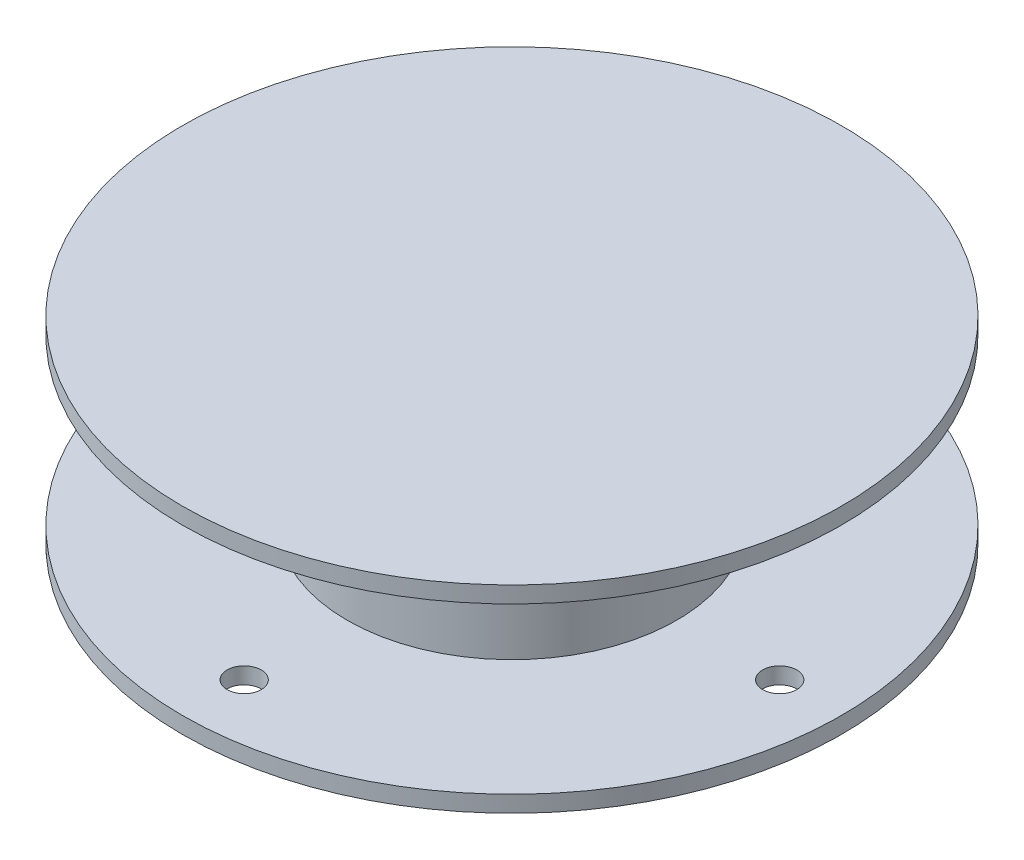
ISO-10303-21;
HEADER;
FILE_DESCRIPTION(('STEP AP214'),'2;1');
FILE_NAME('part.step','',(''),(''),'','','');
FILE_SCHEMA(('AUTOMOTIVE_DESIGN { 1 0 10303 214 1 1 1 1 }'));
ENDSEC;
DATA;
#1=APPLICATION_CONTEXT('core data for automotive mechanical design processes');
#2=APPLICATION_PROTOCOL_DEFINITION('international standard','automotive_design',2000,#1);
#3=PRODUCT_CONTEXT('',#1,'mechanical');
#4=PRODUCT('Part','Part','',(#3));
#5=PRODUCT_RELATED_PRODUCT_CATEGORY('part','',(#4));
#6=PRODUCT_DEFINITION_FORMATION('','',#4);
#7=PRODUCT_DEFINITION_CONTEXT('part definition',#1,'design');
#8=PRODUCT_DEFINITION('design','',#6,#7);
#9=PRODUCT_DEFINITION_SHAPE('','',#8);
#10=(LENGTH_UNIT() NAMED_UNIT(*) SI_UNIT(.MILLI.,.METRE.));
#11=(NAMED_UNIT(*) PLANE_ANGLE_UNIT() SI_UNIT($,.RADIAN.));
#12=(NAMED_UNIT(*) SI_UNIT($,.STERADIAN.) SOLID_ANGLE_UNIT());
#13=UNCERTAINTY_MEASURE_WITH_UNIT(LENGTH_MEASURE(1.E-05),#10,'distance_accuracy_value','');
#14=(GEOMETRIC_REPRESENTATION_CONTEXT(3) GLOBAL_UNCERTAINTY_ASSIGNED_CONTEXT((#13)) GLOBAL_UNIT_ASSIGNED_CONTEXT((#10,
#11,#12)) REPRESENTATION_CONTEXT('',''));
#15=CARTESIAN_POINT('',(0.,0.,0.));
#16=DIRECTION('',(0.,0.,1.));
#17=DIRECTION('',(1.,0.,0.));
#18=AXIS2_PLACEMENT_3D('',#15,#16,#17);
#19=CARTESIAN_POINT('',(0.,2.,0.));
#20=DIRECTION('',(0.,-1.,0.));
#21=DIRECTION('',(0.,0.,-1.));
#22=AXIS2_PLACEMENT_3D('',#19,#20,#21);
#23=CYLINDRICAL_SURFACE('',#22,40.);
#24=CARTESIAN_POINT('',(0.,2.,0.));
#25=DIRECTION('',(0.,1.,0.));
#26=DIRECTION('',(0.,0.,1.));
#27=AXIS2_PLACEMENT_3D('',#24,#25,#26);
#28=CIRCLE('',#27,40.);
#29=CARTESIAN_POINT('',(0.,2.,40.));
#30=VERTEX_POINT('',#29);
#31=EDGE_CURVE('E51',#30,#30,#28,.T.);
#32=ORIENTED_EDGE('',*,*,#31,.F.);
#33=EDGE_LOOP('',(#32));
#34=FACE_BOUND('',#33,.T.);
#35=CARTESIAN_POINT('',(0.,0.,0.));
#36=DIRECTION('',(0.,1.,0.));
#37=DIRECTION('',(0.,0.,1.));
#38=AXIS2_PLACEMENT_3D('',#35,#36,#37);
#39=CIRCLE('',#38,40.);
#40=CARTESIAN_POINT('',(0.,0.,40.));
#41=VERTEX_POINT('',#40);
#42=EDGE_CURVE('E46',#41,#41,#39,.T.);
#43=ORIENTED_EDGE('',*,*,#42,.T.);
#44=EDGE_LOOP('',(#43));
#45=FACE_BOUND('',#44,.T.);
#46=ADVANCED_FACE('F43',(#34,#45),#23,.T.);
#47=CARTESIAN_POINT('',(0.,2.,0.));
#48=DIRECTION('',(0.,1.,0.));
#49=DIRECTION('',(0.,0.,1.));
#50=AXIS2_PLACEMENT_3D('',#47,#48,#49);
#51=PLANE('',#50);
#52=CARTESIAN_POINT('',(0.,2.,32.5));
#53=DIRECTION('',(0.,1.,0.));
#54=DIRECTION('',(0.,0.,1.));
#55=AXIS2_PLACEMENT_3D('',#52,#53,#54);
#56=CIRCLE('',#55,2.07357767100753);
#57=CARTESIAN_POINT('',(0.,2.,30.4264223289925));
#58=VERTEX_POINT('',#57);
#59=EDGE_CURVE('E92',#58,#58,#56,.F.);
#60=ORIENTED_EDGE('',*,*,#59,.T.);
#61=EDGE_LOOP('',(#60));
#62=FACE_BOUND('',#61,.T.);
#63=CARTESIAN_POINT('',(32.5,2.,0.));
#64=DIRECTION('',(0.,1.,0.));
#65=DIRECTION('',(0.,0.,1.));
#66=AXIS2_PLACEMENT_3D('',#63,#64,#65);
#67=CIRCLE('',#66,2.07357767100753);
#68=CARTESIAN_POINT('',(32.5,2.,-2.07357767100753));
#69=VERTEX_POINT('',#68);
#70=EDGE_CURVE('E88',#69,#69,#67,.F.);
#71=ORIENTED_EDGE('',*,*,#70,.T.);
#72=EDGE_LOOP('',(#71));
#73=FACE_BOUND('',#72,.T.);
#74=CARTESIAN_POINT('',(0.,2.,-32.5));
#75=DIRECTION('',(0.,1.,0.));
#76=DIRECTION('',(0.,0.,1.));
#77=AXIS2_PLACEMENT_3D('',#74,#75,#76);
#78=CIRCLE('',#77,2.07357767100753);
#79=CARTESIAN_POINT('',(0.,2.,-34.5735776710075));
#80=VERTEX_POINT('',#79);
#81=EDGE_CURVE('E80',#80,#80,#78,.F.);
#82=ORIENTED_EDGE('',*,*,#81,.T.);
#83=EDGE_LOOP('',(#82));
#84=FACE_BOUND('',#83,.T.);
#85=CARTESIAN_POINT('',(-32.5,2.,0.));
#86=DIRECTION('',(0.,1.,0.));
#87=DIRECTION('',(0.,0.,1.));
#88=AXIS2_PLACEMENT_3D('',#85,#86,#87);
#89=CIRCLE('',#88,2.07357767100753);
#90=CARTESIAN_POINT('',(-32.5,2.,-2.07357767100753));
#91=VERTEX_POINT('',#90);
#92=EDGE_CURVE('E71',#91,#91,#89,.F.);
#93=ORIENTED_EDGE('',*,*,#92,.T.);
#94=EDGE_LOOP('',(#93));
#95=FACE_BOUND('',#94,.T.);
#96=CARTESIAN_POINT('',(0.,2.,0.));
#97=DIRECTION('',(0.,1.,0.));
#98=DIRECTION('',(0.,0.,1.));
#99=AXIS2_PLACEMENT_3D('',#96,#97,#98);
#100=CIRCLE('',#99,20.);
#101=CARTESIAN_POINT('',(0.,2.,20.));
#102=VERTEX_POINT('',#101);
#103=EDGE_CURVE('E10',#102,#102,#100,.T.);
#104=ORIENTED_EDGE('',*,*,#103,.F.);
#105=EDGE_LOOP('',(#104));
#106=FACE_BOUND('',#105,.T.);
#107=ORIENTED_EDGE('',*,*,#31,.T.);
#108=EDGE_LOOP('',(#107));
#109=FACE_BOUND('',#108,.T.);
#110=ADVANCED_FACE('F103',(#62,#73,#84,#95,#106,#109),#51,.T.);
#111=CARTESIAN_POINT('',(0.,0.,0.));
#112=DIRECTION('',(0.,1.,0.));
#113=DIRECTION('',(0.,0.,1.));
#114=AXIS2_PLACEMENT_3D('',#111,#112,#113);
#115=PLANE('',#114);
#116=CARTESIAN_POINT('',(0.,0.,32.5));
#117=DIRECTION('',(0.,-1.,0.));
#118=DIRECTION('',(0.,0.,-1.));
#119=AXIS2_PLACEMENT_3D('',#116,#117,#118);
#120=CIRCLE('',#119,2.07357767100753);
#121=CARTESIAN_POINT('',(0.,0.,30.4264223289925));
#122=VERTEX_POINT('',#121);
#123=EDGE_CURVE('E63',#122,#122,#120,.T.);
#124=ORIENTED_EDGE('',*,*,#123,.F.);
#125=EDGE_LOOP('',(#124));
#126=FACE_BOUND('',#125,.T.);
#127=CARTESIAN_POINT('',(32.5,0.,0.));
#128=DIRECTION('',(0.,-1.,0.));
#129=DIRECTION('',(0.,0.,-1.));
#130=AXIS2_PLACEMENT_3D('',#127,#128,#129);
#131=CIRCLE('',#130,2.07357767100753);
#132=CARTESIAN_POINT('',(32.5,0.,-2.07357767100753));
#133=VERTEX_POINT('',#132);
#134=EDGE_CURVE('E84',#133,#133,#131,.T.);
#135=ORIENTED_EDGE('',*,*,#134,.F.);
#136=EDGE_LOOP('',(#135));
#137=FACE_BOUND('',#136,.T.);
#138=CARTESIAN_POINT('',(0.,0.,-32.5));
#139=DIRECTION('',(0.,-1.,0.));
#140=DIRECTION('',(0.,0.,-1.));
#141=AXIS2_PLACEMENT_3D('',#138,#139,#140);
#142=CIRCLE('',#141,2.07357767100753);
#143=CARTESIAN_POINT('',(0.,0.,-34.5735776710075));
#144=VERTEX_POINT('',#143);
#145=EDGE_CURVE('E75',#144,#144,#142,.T.);
#146=ORIENTED_EDGE('',*,*,#145,.F.);
#147=EDGE_LOOP('',(#146));
#148=FACE_BOUND('',#147,.T.);
#149=CARTESIAN_POINT('',(-32.5,0.,0.));
#150=DIRECTION('',(0.,-1.,0.));
#151=DIRECTION('',(0.,0.,-1.));
#152=AXIS2_PLACEMENT_3D('',#149,#150,#151);
#153=CIRCLE('',#152,2.07357767100753);
#154=CARTESIAN_POINT('',(-32.5,0.,-2.07357767100753));
#155=VERTEX_POINT('',#154);
#156=EDGE_CURVE('E76',#155,#155,#153,.T.);
#157=ORIENTED_EDGE('',*,*,#156,.F.);
#158=EDGE_LOOP('',(#157));
#159=FACE_BOUND('',#158,.T.);
#160=ORIENTED_EDGE('',*,*,#42,.F.);
#161=EDGE_LOOP('',(#160));
#162=FACE_BOUND('',#161,.T.);
#163=ADVANCED_FACE('F113',(#126,#137,#148,#159,#162),#115,.F.);
#164=CARTESIAN_POINT('',(0.,12.,0.));
#165=DIRECTION('',(0.,-1.,0.));
#166=DIRECTION('',(0.,0.,-1.));
#167=AXIS2_PLACEMENT_3D('',#164,#165,#166);
#168=CYLINDRICAL_SURFACE('',#167,20.);
#169=ORIENTED_EDGE('',*,*,#103,.T.);
#170=EDGE_LOOP('',(#169));
#171=FACE_BOUND('',#170,.T.);
#172=CARTESIAN_POINT('',(0.,22.,0.));
#173=DIRECTION('',(0.,1.,0.));
#174=DIRECTION('',(0.,0.,1.));
#175=AXIS2_PLACEMENT_3D('',#172,#173,#174);
#176=CIRCLE('',#175,20.);
#177=CARTESIAN_POINT('',(0.,22.,20.));
#178=VERTEX_POINT('',#177);
#179=EDGE_CURVE('E67',#178,#178,#176,.T.);
#180=ORIENTED_EDGE('',*,*,#179,.F.);
#181=EDGE_LOOP('',(#180));
#182=FACE_BOUND('',#181,.T.);
#183=ADVANCED_FACE('F116',(#171,#182),#168,.T.);
#184=CARTESIAN_POINT('',(0.,22.,0.));
#185=DIRECTION('',(0.,1.,0.));
#186=DIRECTION('',(0.,0.,-1.));
#187=AXIS2_PLACEMENT_3D('',#184,#185,#186);
#188=CYLINDRICAL_SURFACE('',#187,40.);
#189=CARTESIAN_POINT('',(0.,22.,0.));
#190=DIRECTION('',(0.,1.,0.));
#191=DIRECTION('',(0.,0.,1.));
#192=AXIS2_PLACEMENT_3D('',#189,#190,#191);
#193=CIRCLE('',#192,40.);
#194=CARTESIAN_POINT('',(0.,22.,40.));
#195=VERTEX_POINT('',#194);
#196=EDGE_CURVE('E62',#195,#195,#193,.T.);
#197=ORIENTED_EDGE('',*,*,#196,.T.);
#198=EDGE_LOOP('',(#197));
#199=FACE_BOUND('',#198,.T.);
#200=CARTESIAN_POINT('',(0.,24.,0.));
#201=DIRECTION('',(0.,1.,0.));
#202=DIRECTION('',(0.,0.,1.));
#203=AXIS2_PLACEMENT_3D('',#200,#201,#202);
#204=CIRCLE('',#203,40.);
#205=CARTESIAN_POINT('',(0.,24.,40.));
#206=VERTEX_POINT('',#205);
#207=EDGE_CURVE('E58',#206,#206,#204,.T.);
#208=ORIENTED_EDGE('',*,*,#207,.F.);
#209=EDGE_LOOP('',(#208));
#210=FACE_BOUND('',#209,.T.);
#211=ADVANCED_FACE('F141',(#199,#210),#188,.T.);
#212=CARTESIAN_POINT('',(0.,22.,0.));
#213=DIRECTION('',(0.,-1.,0.));
#214=DIRECTION('',(0.,0.,1.));
#215=AXIS2_PLACEMENT_3D('',#212,#213,#214);
#216=PLANE('',#215);
#217=ORIENTED_EDGE('',*,*,#179,.T.);
#218=EDGE_LOOP('',(#217));
#219=FACE_BOUND('',#218,.T.);
#220=ORIENTED_EDGE('',*,*,#196,.F.);
#221=EDGE_LOOP('',(#220));
#222=FACE_BOUND('',#221,.T.);
#223=ADVANCED_FACE('F144',(#219,#222),#216,.T.);
#224=CARTESIAN_POINT('',(0.,24.,0.));
#225=DIRECTION('',(0.,-1.,0.));
#226=DIRECTION('',(0.,0.,1.));
#227=AXIS2_PLACEMENT_3D('',#224,#225,#226);
#228=PLANE('',#227);
#229=ORIENTED_EDGE('',*,*,#207,.T.);
#230=EDGE_LOOP('',(#229));
#231=FACE_BOUND('',#230,.T.);
#232=ADVANCED_FACE('F146',(#231),#228,.F.);
#233=CARTESIAN_POINT('',(-32.5,24.001,0.));
#234=DIRECTION('',(0.,-1.,0.));
#235=DIRECTION('',(0.,0.,-1.));
#236=AXIS2_PLACEMENT_3D('',#233,#234,#235);
#237=CYLINDRICAL_SURFACE('',#236,2.07357767100753);
#238=CARTESIAN_POINT('',(-32.5,2.,-2.07357767100753));
#239=CARTESIAN_POINT('',(-32.5,1.97916666666667,-2.07357767100753));
#240=CARTESIAN_POINT('',(-32.5,1.95833333333333,-2.07357767100753));
#241=CARTESIAN_POINT('',(-32.5,1.91666666666666,-2.07357767100753));
#242=CARTESIAN_POINT('',(-32.5,1.89583333333333,-2.07357767100753));
#243=CARTESIAN_POINT('',(-32.5,1.85416666666666,-2.07357767100753));
#244=CARTESIAN_POINT('',(-32.5,1.83333333333333,-2.07357767100753));
#245=CARTESIAN_POINT('',(-32.5,1.79166666666666,-2.07357767100753));
#246=CARTESIAN_POINT('',(-32.5,1.77083333333333,-2.07357767100753));
#247=CARTESIAN_POINT('',(-32.5,1.72916666666666,-2.07357767100753));
#248=CARTESIAN_POINT('',(-32.5,1.70833333333333,-2.07357767100753));
#249=CARTESIAN_POINT('',(-32.5,1.66666666666666,-2.07357767100753));
#250=CARTESIAN_POINT('',(-32.5,1.64583333333333,-2.07357767100753));
#251=CARTESIAN_POINT('',(-32.5,1.60416666666666,-2.07357767100753));
#252=CARTESIAN_POINT('',(-32.5,1.58333333333333,-2.07357767100753));
#253=CARTESIAN_POINT('',(-32.5,1.54166666666666,-2.07357767100753));
#254=CARTESIAN_POINT('',(-32.5,1.52083333333333,-2.07357767100753));
#255=CARTESIAN_POINT('',(-32.5,1.47916666666667,-2.07357767100753));
#256=CARTESIAN_POINT('',(-32.5,1.45833333333333,-2.07357767100753));
#257=CARTESIAN_POINT('',(-32.5,1.41666666666667,-2.07357767100753));
#258=CARTESIAN_POINT('',(-32.5,1.39583333333333,-2.07357767100753));
#259=CARTESIAN_POINT('',(-32.5,1.35416666666667,-2.07357767100753));
#260=CARTESIAN_POINT('',(-32.5,1.33333333333333,-2.07357767100753));
#261=CARTESIAN_POINT('',(-32.5,1.29166666666667,-2.07357767100753));
#262=CARTESIAN_POINT('',(-32.5,1.27083333333333,-2.07357767100753));
#263=CARTESIAN_POINT('',(-32.5,1.22916666666667,-2.07357767100753));
#264=CARTESIAN_POINT('',(-32.5,1.20833333333333,-2.07357767100753));
#265=CARTESIAN_POINT('',(-32.5,1.16666666666667,-2.07357767100753));
#266=CARTESIAN_POINT('',(-32.5,1.14583333333333,-2.07357767100753));
#267=CARTESIAN_POINT('',(-32.5,1.10416666666667,-2.07357767100753));
#268=CARTESIAN_POINT('',(-32.5,1.08333333333333,-2.07357767100753));
#269=CARTESIAN_POINT('',(-32.5,1.04166666666667,-2.07357767100753));
#270=CARTESIAN_POINT('',(-32.5,1.02083333333333,-2.07357767100753));
#271=CARTESIAN_POINT('',(-32.5,0.979166666666668,-2.07357767100753));
#272=CARTESIAN_POINT('',(-32.5,0.958333333333334,-2.07357767100753));
#273=CARTESIAN_POINT('',(-32.5,0.916666666666668,-2.07357767100753));
#274=CARTESIAN_POINT('',(-32.5,0.895833333333334,-2.07357767100753));
#275=CARTESIAN_POINT('',(-32.5,0.854166666666667,-2.07357767100753));
#276=CARTESIAN_POINT('',(-32.5,0.833333333333334,-2.07357767100753));
#277=CARTESIAN_POINT('',(-32.5,0.791666666666667,-2.07357767100753));
#278=CARTESIAN_POINT('',(-32.5,0.770833333333334,-2.07357767100753));
#279=CARTESIAN_POINT('',(-32.5,0.729166666666667,-2.07357767100753));
#280=CARTESIAN_POINT('',(-32.5,0.708333333333334,-2.07357767100753));
#281=CARTESIAN_POINT('',(-32.5,0.666666666666667,-2.07357767100753));
#282=CARTESIAN_POINT('',(-32.5,0.645833333333334,-2.07357767100753));
#283=CARTESIAN_POINT('',(-32.5,0.604166666666667,-2.07357767100753));
#284=CARTESIAN_POINT('',(-32.5,0.583333333333334,-2.07357767100753));
#285=CARTESIAN_POINT('',(-32.5,0.541666666666668,-2.07357767100753));
#286=CARTESIAN_POINT('',(-32.5,0.520833333333336,-2.07357767100753));
#287=CARTESIAN_POINT('',(-32.5,0.479166666666671,-2.07357767100753));
#288=CARTESIAN_POINT('',(-32.5,0.458333333333337,-2.07357767100753));
#289=CARTESIAN_POINT('',(-32.5,0.416666666666671,-2.07357767100753));
#290=CARTESIAN_POINT('',(-32.5,0.395833333333337,-2.07357767100753));
#291=CARTESIAN_POINT('',(-32.5,0.35416666666667,-2.07357767100753));
#292=CARTESIAN_POINT('',(-32.5,0.333333333333337,-2.07357767100753));
#293=CARTESIAN_POINT('',(-32.5,0.29166666666667,-2.07357767100753));
#294=CARTESIAN_POINT('',(-32.5,0.270833333333337,-2.07357767100753));
#295=CARTESIAN_POINT('',(-32.5,0.22916666666667,-2.07357767100753));
#296=CARTESIAN_POINT('',(-32.5,0.208333333333337,-2.07357767100753));
#297=CARTESIAN_POINT('',(-32.5,0.16666666666667,-2.07357767100753));
#298=CARTESIAN_POINT('',(-32.5,0.145833333333337,-2.07357767100753));
#299=CARTESIAN_POINT('',(-32.5,0.10416666666667,-2.07357767100753));
#300=CARTESIAN_POINT('',(-32.5,0.0833333333333369,-2.07357767100753));
#301=CARTESIAN_POINT('',(-32.5,0.0416666666666702,-2.07357767100753));
#302=CARTESIAN_POINT('',(-32.5,0.0208333333333368,-2.07357767100753));
#303=CARTESIAN_POINT('',(-32.5,0.,-2.07357767100753));
#304=B_SPLINE_CURVE_WITH_KNOTS('',3,(#238,#239,#240,#241,#242,#243,#244,#245,#246,#247,#248,
#249,#250,#251,#252,#253,#254,#255,#256,#257,#258,#259,#260,#261,#262,#263,#264,#265,#266,#267,
#268,#269,#270,#271,#272,#273,#274,#275,#276,#277,#278,#279,#280,#281,#282,#283,#284,#285,#286,
#287,#288,#289,#290,#291,#292,#293,#294,#295,#296,#297,#298,#299,#300,#301,#302,#303),
.UNSPECIFIED.,.F.,.F.,(4,2,2,2,2,2,2,2,2,2,2,2,2,2,2,2,2,2,2,2,2,2,2,2,2,2,2,2,2,2,2,2,4),(0.,
0.0625000000000001,0.125,0.1875,0.25,0.3125,0.375,0.4375,0.5,0.562499999999997,
0.624999999999997,0.687499999999997,0.749999999999997,0.812499999999997,0.874999999999997,
0.937499999999997,0.999999999999997,1.0625,1.125,1.1875,1.25,1.3125,1.375,1.4375,
1.49999999999999,1.56249999999999,1.62499999999999,1.68749999999999,1.74999999999999,
1.81249999999999,1.87499999999999,1.93749999999999,1.99999999999999),.UNSPECIFIED.);
#305=EDGE_CURVE('BSEAM148',#91,#155,#304,.T.);
#306=ORIENTED_EDGE('',*,*,#92,.F.);
#307=ORIENTED_EDGE('',*,*,#156,.T.);
#308=ORIENTED_EDGE('',*,*,#305,.T.);
#309=ORIENTED_EDGE('',*,*,#305,.F.);
#310=EDGE_LOOP('',(#306,#308,#307,#309));
#311=FACE_BOUND('',#310,.T.);
#312=ADVANCED_FACE('F148',(#311),#237,.F.);
#313=CARTESIAN_POINT('',(0.,24.001,-32.5));
#314=DIRECTION('',(0.,-1.,0.));
#315=DIRECTION('',(0.,0.,-1.));
#316=AXIS2_PLACEMENT_3D('',#313,#314,#315);
#317=CYLINDRICAL_SURFACE('',#316,2.07357767100753);
#318=CARTESIAN_POINT('',(0.,2.,-34.5735776710075));
#319=CARTESIAN_POINT('',(0.,1.97916666666667,-34.5735776710075));
#320=CARTESIAN_POINT('',(0.,1.95833333333333,-34.5735776710075));
#321=CARTESIAN_POINT('',(0.,1.91666666666666,-34.5735776710075));
#322=CARTESIAN_POINT('',(0.,1.89583333333333,-34.5735776710075));
#323=CARTESIAN_POINT('',(0.,1.85416666666666,-34.5735776710075));
#324=CARTESIAN_POINT('',(0.,1.83333333333333,-34.5735776710075));
#325=CARTESIAN_POINT('',(0.,1.79166666666666,-34.5735776710075));
#326=CARTESIAN_POINT('',(0.,1.77083333333333,-34.5735776710075));
#327=CARTESIAN_POINT('',(0.,1.72916666666666,-34.5735776710075));
#328=CARTESIAN_POINT('',(0.,1.70833333333333,-34.5735776710075));
#329=CARTESIAN_POINT('',(0.,1.66666666666666,-34.5735776710075));
#330=CARTESIAN_POINT('',(0.,1.64583333333333,-34.5735776710075));
#331=CARTESIAN_POINT('',(0.,1.60416666666666,-34.5735776710075));
#332=CARTESIAN_POINT('',(0.,1.58333333333333,-34.5735776710075));
#333=CARTESIAN_POINT('',(0.,1.54166666666666,-34.5735776710075));
#334=CARTESIAN_POINT('',(0.,1.52083333333333,-34.5735776710075));
#335=CARTESIAN_POINT('',(0.,1.47916666666667,-34.5735776710075));
#336=CARTESIAN_POINT('',(0.,1.45833333333333,-34.5735776710075));
#337=CARTESIAN_POINT('',(0.,1.41666666666667,-34.5735776710075));
#338=CARTESIAN_POINT('',(0.,1.39583333333333,-34.5735776710075));
#339=CARTESIAN_POINT('',(0.,1.35416666666667,-34.5735776710075));
#340=CARTESIAN_POINT('',(0.,1.33333333333333,-34.5735776710075));
#341=CARTESIAN_POINT('',(0.,1.29166666666667,-34.5735776710075));
#342=CARTESIAN_POINT('',(0.,1.27083333333333,-34.5735776710075));
#343=CARTESIAN_POINT('',(0.,1.22916666666667,-34.5735776710075));
#344=CARTESIAN_POINT('',(0.,1.20833333333333,-34.5735776710075));
#345=CARTESIAN_POINT('',(0.,1.16666666666667,-34.5735776710075));
#346=CARTESIAN_POINT('',(0.,1.14583333333333,-34.5735776710075));
#347=CARTESIAN_POINT('',(0.,1.10416666666667,-34.5735776710075));
#348=CARTESIAN_POINT('',(0.,1.08333333333333,-34.5735776710075));
#349=CARTESIAN_POINT('',(0.,1.04166666666667,-34.5735776710075));
#350=CARTESIAN_POINT('',(0.,1.02083333333333,-34.5735776710075));
#351=CARTESIAN_POINT('',(0.,0.979166666666668,-34.5735776710075));
#352=CARTESIAN_POINT('',(0.,0.958333333333334,-34.5735776710075));
#353=CARTESIAN_POINT('',(0.,0.916666666666668,-34.5735776710075));
#354=CARTESIAN_POINT('',(0.,0.895833333333334,-34.5735776710075));
#355=CARTESIAN_POINT('',(0.,0.854166666666667,-34.5735776710075));
#356=CARTESIAN_POINT('',(0.,0.833333333333334,-34.5735776710075));
#357=CARTESIAN_POINT('',(0.,0.791666666666667,-34.5735776710075));
#358=CARTESIAN_POINT('',(0.,0.770833333333334,-34.5735776710075));
#359=CARTESIAN_POINT('',(0.,0.729166666666667,-34.5735776710075));
#360=CARTESIAN_POINT('',(0.,0.708333333333334,-34.5735776710075));
#361=CARTESIAN_POINT('',(0.,0.666666666666667,-34.5735776710075));
#362=CARTESIAN_POINT('',(0.,0.645833333333334,-34.5735776710075));
#363=CARTESIAN_POINT('',(0.,0.604166666666667,-34.5735776710075));
#364=CARTESIAN_POINT('',(0.,0.583333333333334,-34.5735776710075));
#365=CARTESIAN_POINT('',(0.,0.541666666666668,-34.5735776710075));
#366=CARTESIAN_POINT('',(0.,0.520833333333336,-34.5735776710075));
#367=CARTESIAN_POINT('',(0.,0.479166666666671,-34.5735776710075));
#368=CARTESIAN_POINT('',(0.,0.458333333333337,-34.5735776710075));
#369=CARTESIAN_POINT('',(0.,0.416666666666671,-34.5735776710075));
#370=CARTESIAN_POINT('',(0.,0.395833333333337,-34.5735776710075));
#371=CARTESIAN_POINT('',(0.,0.35416666666667,-34.5735776710075));
#372=CARTESIAN_POINT('',(0.,0.333333333333337,-34.5735776710075));
#373=CARTESIAN_POINT('',(0.,0.29166666666667,-34.5735776710075));
#374=CARTESIAN_POINT('',(0.,0.270833333333337,-34.5735776710075));
#375=CARTESIAN_POINT('',(0.,0.22916666666667,-34.5735776710075));
#376=CARTESIAN_POINT('',(0.,0.208333333333337,-34.5735776710075));
#377=CARTESIAN_POINT('',(0.,0.16666666666667,-34.5735776710075));
#378=CARTESIAN_POINT('',(0.,0.145833333333337,-34.5735776710075));
#379=CARTESIAN_POINT('',(0.,0.10416666666667,-34.5735776710075));
#380=CARTESIAN_POINT('',(0.,0.0833333333333369,-34.5735776710075));
#381=CARTESIAN_POINT('',(0.,0.0416666666666702,-34.5735776710075));
#382=CARTESIAN_POINT('',(0.,0.0208333333333368,-34.5735776710075));
#383=CARTESIAN_POINT('',(0.,0.,-34.5735776710075));
#384=B_SPLINE_CURVE_WITH_KNOTS('',3,(#318,#319,#320,#321,#322,#323,#324,#325,#326,#327,#328,
#329,#330,#331,#332,#333,#334,#335,#336,#337,#338,#339,#340,#341,#342,#343,#344,#345,#346,#347,
#348,#349,#350,#351,#352,#353,#354,#355,#356,#357,#358,#359,#360,#361,#362,#363,#364,#365,#366,
#367,#368,#369,#370,#371,#372,#373,#374,#375,#376,#377,#378,#379,#380,#381,#382,#383),
.UNSPECIFIED.,.F.,.F.,(4,2,2,2,2,2,2,2,2,2,2,2,2,2,2,2,2,2,2,2,2,2,2,2,2,2,2,2,2,2,2,2,4),(0.,
0.0625000000000001,0.125,0.1875,0.25,0.3125,0.375,0.4375,0.5,0.562499999999997,
0.624999999999997,0.687499999999997,0.749999999999997,0.812499999999997,0.874999999999997,
0.937499999999997,0.999999999999997,1.0625,1.125,1.1875,1.25,1.3125,1.375,1.4375,
1.49999999999999,1.56249999999999,1.62499999999999,1.68749999999999,1.74999999999999,
1.81249999999999,1.87499999999999,1.93749999999999,1.99999999999999),.UNSPECIFIED.);
#385=EDGE_CURVE('BSEAM155',#80,#144,#384,.T.);
#386=ORIENTED_EDGE('',*,*,#81,.F.);
#387=ORIENTED_EDGE('',*,*,#145,.T.);
#388=ORIENTED_EDGE('',*,*,#385,.T.);
#389=ORIENTED_EDGE('',*,*,#385,.F.);
#390=EDGE_LOOP('',(#386,#388,#387,#389));
#391=FACE_BOUND('',#390,.T.);
#392=ADVANCED_FACE('F155',(#391),#317,.F.);
#393=CARTESIAN_POINT('',(32.5,24.001,0.));
#394=DIRECTION('',(0.,-1.,0.));
#395=DIRECTION('',(0.,0.,-1.));
#396=AXIS2_PLACEMENT_3D('',#393,#394,#395);
#397=CYLINDRICAL_SURFACE('',#396,2.07357767100753);
#398=CARTESIAN_POINT('',(32.5,2.,-2.07357767100753));
#399=CARTESIAN_POINT('',(32.5,1.97916666666667,-2.07357767100753));
#400=CARTESIAN_POINT('',(32.5,1.95833333333333,-2.07357767100753));
#401=CARTESIAN_POINT('',(32.5,1.91666666666666,-2.07357767100753));
#402=CARTESIAN_POINT('',(32.5,1.89583333333333,-2.07357767100753));
#403=CARTESIAN_POINT('',(32.5,1.85416666666666,-2.07357767100753));
#404=CARTESIAN_POINT('',(32.5,1.83333333333333,-2.07357767100753));
#405=CARTESIAN_POINT('',(32.5,1.79166666666666,-2.07357767100753));
#406=CARTESIAN_POINT('',(32.5,1.77083333333333,-2.07357767100753));
#407=CARTESIAN_POINT('',(32.5,1.72916666666666,-2.07357767100753));
#408=CARTESIAN_POINT('',(32.5,1.70833333333333,-2.07357767100753));
#409=CARTESIAN_POINT('',(32.5,1.66666666666666,-2.07357767100753));
#410=CARTESIAN_POINT('',(32.5,1.64583333333333,-2.07357767100753));
#411=CARTESIAN_POINT('',(32.5,1.60416666666666,-2.07357767100753));
#412=CARTESIAN_POINT('',(32.5,1.58333333333333,-2.07357767100753));
#413=CARTESIAN_POINT('',(32.5,1.54166666666666,-2.07357767100753));
#414=CARTESIAN_POINT('',(32.5,1.52083333333333,-2.07357767100753));
#415=CARTESIAN_POINT('',(32.5,1.47916666666667,-2.07357767100753));
#416=CARTESIAN_POINT('',(32.5,1.45833333333333,-2.07357767100753));
#417=CARTESIAN_POINT('',(32.5,1.41666666666667,-2.07357767100753));
#418=CARTESIAN_POINT('',(32.5,1.39583333333333,-2.07357767100753));
#419=CARTESIAN_POINT('',(32.5,1.35416666666667,-2.07357767100753));
#420=CARTESIAN_POINT('',(32.5,1.33333333333333,-2.07357767100753));
#421=CARTESIAN_POINT('',(32.5,1.29166666666667,-2.07357767100753));
#422=CARTESIAN_POINT('',(32.5,1.27083333333333,-2.07357767100753));
#423=CARTESIAN_POINT('',(32.5,1.22916666666667,-2.07357767100753));
#424=CARTESIAN_POINT('',(32.5,1.20833333333333,-2.07357767100753));
#425=CARTESIAN_POINT('',(32.5,1.16666666666667,-2.07357767100753));
#426=CARTESIAN_POINT('',(32.5,1.14583333333333,-2.07357767100753));
#427=CARTESIAN_POINT('',(32.5,1.10416666666667,-2.07357767100753));
#428=CARTESIAN_POINT('',(32.5,1.08333333333333,-2.07357767100753));
#429=CARTESIAN_POINT('',(32.5,1.04166666666667,-2.07357767100753));
#430=CARTESIAN_POINT('',(32.5,1.02083333333333,-2.07357767100753));
#431=CARTESIAN_POINT('',(32.5,0.979166666666668,-2.07357767100753));
#432=CARTESIAN_POINT('',(32.5,0.958333333333334,-2.07357767100753));
#433=CARTESIAN_POINT('',(32.5,0.916666666666668,-2.07357767100753));
#434=CARTESIAN_POINT('',(32.5,0.895833333333334,-2.07357767100753));
#435=CARTESIAN_POINT('',(32.5,0.854166666666667,-2.07357767100753));
#436=CARTESIAN_POINT('',(32.5,0.833333333333334,-2.07357767100753));
#437=CARTESIAN_POINT('',(32.5,0.791666666666667,-2.07357767100753));
#438=CARTESIAN_POINT('',(32.5,0.770833333333334,-2.07357767100753));
#439=CARTESIAN_POINT('',(32.5,0.729166666666667,-2.07357767100753));
#440=CARTESIAN_POINT('',(32.5,0.708333333333334,-2.07357767100753));
#441=CARTESIAN_POINT('',(32.5,0.666666666666667,-2.07357767100753));
#442=CARTESIAN_POINT('',(32.5,0.645833333333334,-2.07357767100753));
#443=CARTESIAN_POINT('',(32.5,0.604166666666667,-2.07357767100753));
#444=CARTESIAN_POINT('',(32.5,0.583333333333334,-2.07357767100753));
#445=CARTESIAN_POINT('',(32.5,0.541666666666668,-2.07357767100753));
#446=CARTESIAN_POINT('',(32.5,0.520833333333336,-2.07357767100753));
#447=CARTESIAN_POINT('',(32.5,0.479166666666671,-2.07357767100753));
#448=CARTESIAN_POINT('',(32.5,0.458333333333337,-2.07357767100753));
#449=CARTESIAN_POINT('',(32.5,0.416666666666671,-2.07357767100753));
#450=CARTESIAN_POINT('',(32.5,0.395833333333337,-2.07357767100753));
#451=CARTESIAN_POINT('',(32.5,0.35416666666667,-2.07357767100753));
#452=CARTESIAN_POINT('',(32.5,0.333333333333337,-2.07357767100753));
#453=CARTESIAN_POINT('',(32.5,0.29166666666667,-2.07357767100753));
#454=CARTESIAN_POINT('',(32.5,0.270833333333337,-2.07357767100753));
#455=CARTESIAN_POINT('',(32.5,0.22916666666667,-2.07357767100753));
#456=CARTESIAN_POINT('',(32.5,0.208333333333337,-2.07357767100753));
#457=CARTESIAN_POINT('',(32.5,0.16666666666667,-2.07357767100753));
#458=CARTESIAN_POINT('',(32.5,0.145833333333337,-2.07357767100753));
#459=CARTESIAN_POINT('',(32.5,0.10416666666667,-2.07357767100753));
#460=CARTESIAN_POINT('',(32.5,0.0833333333333369,-2.07357767100753));
#461=CARTESIAN_POINT('',(32.5,0.0416666666666702,-2.07357767100753));
#462=CARTESIAN_POINT('',(32.5,0.0208333333333368,-2.07357767100753));
#463=CARTESIAN_POINT('',(32.5,0.,-2.07357767100753));
#464=B_SPLINE_CURVE_WITH_KNOTS('',3,(#398,#399,#400,#401,#402,#403,#404,#405,#406,#407,#408,
#409,#410,#411,#412,#413,#414,#415,#416,#417,#418,#419,#420,#421,#422,#423,#424,#425,#426,#427,
#428,#429,#430,#431,#432,#433,#434,#435,#436,#437,#438,#439,#440,#441,#442,#443,#444,#445,#446,
#447,#448,#449,#450,#451,#452,#453,#454,#455,#456,#457,#458,#459,#460,#461,#462,#463),
.UNSPECIFIED.,.F.,.F.,(4,2,2,2,2,2,2,2,2,2,2,2,2,2,2,2,2,2,2,2,2,2,2,2,2,2,2,2,2,2,2,2,4),(0.,
0.0625000000000001,0.125,0.1875,0.25,0.3125,0.375,0.4375,0.5,0.562499999999997,
0.624999999999997,0.687499999999997,0.749999999999997,0.812499999999997,0.874999999999997,
0.937499999999997,0.999999999999997,1.0625,1.125,1.1875,1.25,1.3125,1.375,1.4375,
1.49999999999999,1.56249999999999,1.62499999999999,1.68749999999999,1.74999999999999,
1.81249999999999,1.87499999999999,1.93749999999999,1.99999999999999),.UNSPECIFIED.);
#465=EDGE_CURVE('BSEAM109',#69,#133,#464,.T.);
#466=ORIENTED_EDGE('',*,*,#70,.F.);
#467=ORIENTED_EDGE('',*,*,#134,.T.);
#468=ORIENTED_EDGE('',*,*,#465,.T.);
#469=ORIENTED_EDGE('',*,*,#465,.F.);
#470=EDGE_LOOP('',(#466,#468,#467,#469));
#471=FACE_BOUND('',#470,.T.);
#472=ADVANCED_FACE('F109',(#471),#397,.F.);
#473=CARTESIAN_POINT('',(0.,24.001,32.5));
#474=DIRECTION('',(0.,-1.,0.));
#475=DIRECTION('',(0.,0.,-1.));
#476=AXIS2_PLACEMENT_3D('',#473,#474,#475);
#477=CYLINDRICAL_SURFACE('',#476,2.07357767100753);
#478=CARTESIAN_POINT('',(0.,2.,30.4264223289925));
#479=CARTESIAN_POINT('',(0.,1.97916666666667,30.4264223289925));
#480=CARTESIAN_POINT('',(0.,1.95833333333333,30.4264223289925));
#481=CARTESIAN_POINT('',(0.,1.91666666666666,30.4264223289925));
#482=CARTESIAN_POINT('',(0.,1.89583333333333,30.4264223289925));
#483=CARTESIAN_POINT('',(0.,1.85416666666666,30.4264223289925));
#484=CARTESIAN_POINT('',(0.,1.83333333333333,30.4264223289925));
#485=CARTESIAN_POINT('',(0.,1.79166666666666,30.4264223289925));
#486=CARTESIAN_POINT('',(0.,1.77083333333333,30.4264223289925));
#487=CARTESIAN_POINT('',(0.,1.72916666666666,30.4264223289925));
#488=CARTESIAN_POINT('',(0.,1.70833333333333,30.4264223289925));
#489=CARTESIAN_POINT('',(0.,1.66666666666666,30.4264223289925));
#490=CARTESIAN_POINT('',(0.,1.64583333333333,30.4264223289925));
#491=CARTESIAN_POINT('',(0.,1.60416666666666,30.4264223289925));
#492=CARTESIAN_POINT('',(0.,1.58333333333333,30.4264223289925));
#493=CARTESIAN_POINT('',(0.,1.54166666666666,30.4264223289925));
#494=CARTESIAN_POINT('',(0.,1.52083333333333,30.4264223289925));
#495=CARTESIAN_POINT('',(0.,1.47916666666667,30.4264223289925));
#496=CARTESIAN_POINT('',(0.,1.45833333333333,30.4264223289925));
#497=CARTESIAN_POINT('',(0.,1.41666666666667,30.4264223289925));
#498=CARTESIAN_POINT('',(0.,1.39583333333333,30.4264223289925));
#499=CARTESIAN_POINT('',(0.,1.35416666666667,30.4264223289925));
#500=CARTESIAN_POINT('',(0.,1.33333333333333,30.4264223289925));
#501=CARTESIAN_POINT('',(0.,1.29166666666667,30.4264223289925));
#502=CARTESIAN_POINT('',(0.,1.27083333333333,30.4264223289925));
#503=CARTESIAN_POINT('',(0.,1.22916666666667,30.4264223289925));
#504=CARTESIAN_POINT('',(0.,1.20833333333333,30.4264223289925));
#505=CARTESIAN_POINT('',(0.,1.16666666666667,30.4264223289925));
#506=CARTESIAN_POINT('',(0.,1.14583333333333,30.4264223289925));
#507=CARTESIAN_POINT('',(0.,1.10416666666667,30.4264223289925));
#508=CARTESIAN_POINT('',(0.,1.08333333333333,30.4264223289925));
#509=CARTESIAN_POINT('',(0.,1.04166666666667,30.4264223289925));
#510=CARTESIAN_POINT('',(0.,1.02083333333333,30.4264223289925));
#511=CARTESIAN_POINT('',(0.,0.979166666666668,30.4264223289925));
#512=CARTESIAN_POINT('',(0.,0.958333333333334,30.4264223289925));
#513=CARTESIAN_POINT('',(0.,0.916666666666668,30.4264223289925));
#514=CARTESIAN_POINT('',(0.,0.895833333333334,30.4264223289925));
#515=CARTESIAN_POINT('',(0.,0.854166666666667,30.4264223289925));
#516=CARTESIAN_POINT('',(0.,0.833333333333334,30.4264223289925));
#517=CARTESIAN_POINT('',(0.,0.791666666666667,30.4264223289925));
#518=CARTESIAN_POINT('',(0.,0.770833333333334,30.4264223289925));
#519=CARTESIAN_POINT('',(0.,0.729166666666667,30.4264223289925));
#520=CARTESIAN_POINT('',(0.,0.708333333333334,30.4264223289925));
#521=CARTESIAN_POINT('',(0.,0.666666666666667,30.4264223289925));
#522=CARTESIAN_POINT('',(0.,0.645833333333334,30.4264223289925));
#523=CARTESIAN_POINT('',(0.,0.604166666666667,30.4264223289925));
#524=CARTESIAN_POINT('',(0.,0.583333333333334,30.4264223289925));
#525=CARTESIAN_POINT('',(0.,0.541666666666668,30.4264223289925));
#526=CARTESIAN_POINT('',(0.,0.520833333333336,30.4264223289925));
#527=CARTESIAN_POINT('',(0.,0.479166666666671,30.4264223289925));
#528=CARTESIAN_POINT('',(0.,0.458333333333337,30.4264223289925));
#529=CARTESIAN_POINT('',(0.,0.416666666666671,30.4264223289925));
#530=CARTESIAN_POINT('',(0.,0.395833333333337,30.4264223289925));
#531=CARTESIAN_POINT('',(0.,0.35416666666667,30.4264223289925));
#532=CARTESIAN_POINT('',(0.,0.333333333333337,30.4264223289925));
#533=CARTESIAN_POINT('',(0.,0.29166666666667,30.4264223289925));
#534=CARTESIAN_POINT('',(0.,0.270833333333337,30.4264223289925));
#535=CARTESIAN_POINT('',(0.,0.22916666666667,30.4264223289925));
#536=CARTESIAN_POINT('',(0.,0.208333333333337,30.4264223289925));
#537=CARTESIAN_POINT('',(0.,0.16666666666667,30.4264223289925));
#538=CARTESIAN_POINT('',(0.,0.145833333333337,30.4264223289925));
#539=CARTESIAN_POINT('',(0.,0.10416666666667,30.4264223289925));
#540=CARTESIAN_POINT('',(0.,0.0833333333333369,30.4264223289925));
#541=CARTESIAN_POINT('',(0.,0.0416666666666702,30.4264223289925));
#542=CARTESIAN_POINT('',(0.,0.0208333333333368,30.4264223289925));
#543=CARTESIAN_POINT('',(0.,0.,30.4264223289925));
#544=B_SPLINE_CURVE_WITH_KNOTS('',3,(#478,#479,#480,#481,#482,#483,#484,#485,#486,#487,#488,
#489,#490,#491,#492,#493,#494,#495,#496,#497,#498,#499,#500,#501,#502,#503,#504,#505,#506,#507,
#508,#509,#510,#511,#512,#513,#514,#515,#516,#517,#518,#519,#520,#521,#522,#523,#524,#525,#526,
#527,#528,#529,#530,#531,#532,#533,#534,#535,#536,#537,#538,#539,#540,#541,#542,#543),
.UNSPECIFIED.,.F.,.F.,(4,2,2,2,2,2,2,2,2,2,2,2,2,2,2,2,2,2,2,2,2,2,2,2,2,2,2,2,2,2,2,2,4),(0.,
0.0625000000000001,0.125,0.1875,0.25,0.3125,0.375,0.4375,0.5,0.562499999999997,
0.624999999999997,0.687499999999997,0.749999999999997,0.812499999999997,0.874999999999997,
0.937499999999997,0.999999999999997,1.0625,1.125,1.1875,1.25,1.3125,1.375,1.4375,
1.49999999999999,1.56249999999999,1.62499999999999,1.68749999999999,1.74999999999999,
1.81249999999999,1.87499999999999,1.93749999999999,1.99999999999999),.UNSPECIFIED.);
#545=EDGE_CURVE('BSEAM106',#58,#122,#544,.T.);
#546=ORIENTED_EDGE('',*,*,#59,.F.);
#547=ORIENTED_EDGE('',*,*,#123,.T.);
#548=ORIENTED_EDGE('',*,*,#545,.T.);
#549=ORIENTED_EDGE('',*,*,#545,.F.);
#550=EDGE_LOOP('',(#546,#548,#547,#549));
#551=FACE_BOUND('',#550,.T.);
#552=ADVANCED_FACE('F106',(#551),#477,.F.);
#553=CLOSED_SHELL('',(#46,#110,#163,#183,#211,#223,#232,#312,#392,#472,#552));
#554=MANIFOLD_SOLID_BREP('B2',#553);
#555=ADVANCED_BREP_SHAPE_REPRESENTATION('',(#18,#554),#14);
#556=SHAPE_DEFINITION_REPRESENTATION(#9,#555);
ENDSEC;
END-ISO-10303-21;
